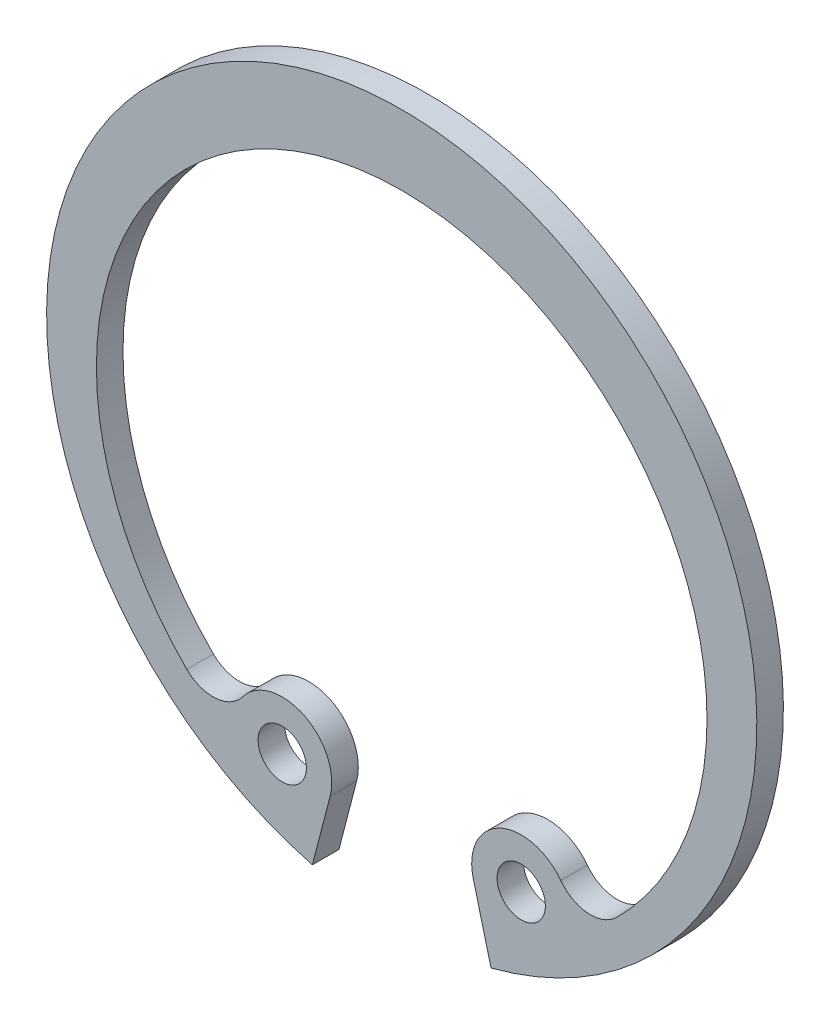
ISO-10303-21;
HEADER;
FILE_DESCRIPTION(('STEP AP214'),'2;1');
FILE_NAME('part.step','',(''),(''),'','','');
FILE_SCHEMA(('AUTOMOTIVE_DESIGN { 1 0 10303 214 1 1 1 1 }'));
ENDSEC;
DATA;
#1=APPLICATION_CONTEXT('core data for automotive mechanical design processes');
#2=APPLICATION_PROTOCOL_DEFINITION('international standard','automotive_design',2000,#1);
#3=PRODUCT_CONTEXT('',#1,'mechanical');
#4=PRODUCT('Part','Part','',(#3));
#5=PRODUCT_RELATED_PRODUCT_CATEGORY('part','',(#4));
#6=PRODUCT_DEFINITION_FORMATION('','',#4);
#7=PRODUCT_DEFINITION_CONTEXT('part definition',#1,'design');
#8=PRODUCT_DEFINITION('design','',#6,#7);
#9=PRODUCT_DEFINITION_SHAPE('','',#8);
#10=(LENGTH_UNIT() NAMED_UNIT(*) SI_UNIT(.MILLI.,.METRE.));
#11=(NAMED_UNIT(*) PLANE_ANGLE_UNIT() SI_UNIT($,.RADIAN.));
#12=(NAMED_UNIT(*) SI_UNIT($,.STERADIAN.) SOLID_ANGLE_UNIT());
#13=UNCERTAINTY_MEASURE_WITH_UNIT(LENGTH_MEASURE(1.E-05),#10,'distance_accuracy_value','');
#14=(GEOMETRIC_REPRESENTATION_CONTEXT(3) GLOBAL_UNCERTAINTY_ASSIGNED_CONTEXT((#13)) GLOBAL_UNIT_ASSIGNED_CONTEXT((#10,
#11,#12)) REPRESENTATION_CONTEXT('',''));
#15=CARTESIAN_POINT('',(0.,0.,0.));
#16=DIRECTION('',(0.,0.,1.));
#17=DIRECTION('',(1.,0.,0.));
#18=AXIS2_PLACEMENT_3D('',#15,#16,#17);
#19=CARTESIAN_POINT('',(0.,0.,-1.1));
#20=DIRECTION('',(0.,0.,1.));
#21=DIRECTION('',(1.,0.,0.));
#22=AXIS2_PLACEMENT_3D('',#19,#20,#21);
#23=CYLINDRICAL_SURFACE('',#22,14.7);
#24=CARTESIAN_POINT('',(0.,0.,0.));
#25=DIRECTION('',(0.,0.,1.));
#26=DIRECTION('',(1.,0.,0.));
#27=AXIS2_PLACEMENT_3D('',#24,#25,#26);
#28=CIRCLE('',#27,14.7);
#29=CARTESIAN_POINT('',(3.69832542704429,-14.2271708022248,0.));
#30=VERTEX_POINT('',#29);
#31=CARTESIAN_POINT('',(-3.69832542704429,-14.2271708022248,0.));
#32=VERTEX_POINT('',#31);
#33=EDGE_CURVE('E129',#30,#32,#28,.T.);
#34=ORIENTED_EDGE('',*,*,#33,.F.);
#35=DIRECTION('',(0.,0.,1.));
#36=VECTOR('',#35,1.);
#37=CARTESIAN_POINT('',(3.69832542704429,-14.2271708022248,-1.1));
#38=LINE('',#37,#36);
#39=CARTESIAN_POINT('',(3.69832542704429,-14.2271708022248,-1.1));
#40=VERTEX_POINT('',#39);
#41=EDGE_CURVE('E11',#40,#30,#38,.T.);
#42=ORIENTED_EDGE('',*,*,#41,.F.);
#43=CARTESIAN_POINT('',(0.,0.,-1.1));
#44=DIRECTION('',(0.,0.,1.));
#45=DIRECTION('',(1.,0.,0.));
#46=AXIS2_PLACEMENT_3D('',#43,#44,#45);
#47=CIRCLE('',#46,14.7);
#48=CARTESIAN_POINT('',(-3.69832542704429,-14.2271708022248,-1.1));
#49=VERTEX_POINT('',#48);
#50=EDGE_CURVE('E150',#40,#49,#47,.T.);
#51=ORIENTED_EDGE('',*,*,#50,.T.);
#52=DIRECTION('',(0.,0.,1.));
#53=VECTOR('',#52,1.);
#54=CARTESIAN_POINT('',(-3.69832542704429,-14.2271708022248,-1.1));
#55=LINE('',#54,#53);
#56=EDGE_CURVE('E35',#49,#32,#55,.T.);
#57=ORIENTED_EDGE('',*,*,#56,.T.);
#58=EDGE_LOOP('',(#34,#42,#51,#57));
#59=FACE_BOUND('',#58,.T.);
#60=ADVANCED_FACE('F32',(#59),#23,.T.);
#61=CARTESIAN_POINT('',(3.69832542704429,-14.2271708022248,-1.1));
#62=DIRECTION('',(-0.967834748450666,-0.25158676374451,0.));
#63=DIRECTION('',(0.25158676374451,-0.967834748450666,0.));
#64=AXIS2_PLACEMENT_3D('',#61,#62,#63);
#65=PLANE('',#64);
#66=DIRECTION('',(0.25158676374451,-0.967834748450666,0.));
#67=VECTOR('',#66,1.);
#68=CARTESIAN_POINT('',(3.69832542704429,-14.2271708022248,0.));
#69=LINE('',#68,#67);
#70=CARTESIAN_POINT('',(2.96189326229575,-11.3941734365757,0.));
#71=VERTEX_POINT('',#70);
#72=EDGE_CURVE('E148',#71,#30,#69,.T.);
#73=ORIENTED_EDGE('',*,*,#72,.F.);
#74=DIRECTION('',(0.,0.,1.));
#75=VECTOR('',#74,1.);
#76=CARTESIAN_POINT('',(2.96189326229575,-11.3941734365757,-1.1));
#77=LINE('',#76,#75);
#78=CARTESIAN_POINT('',(2.96189326229575,-11.3941734365757,-1.1));
#79=VERTEX_POINT('',#78);
#80=EDGE_CURVE('E41',#79,#71,#77,.T.);
#81=ORIENTED_EDGE('',*,*,#80,.F.);
#82=DIRECTION('',(0.25158676374451,-0.967834748450666,0.));
#83=VECTOR('',#82,1.);
#84=CARTESIAN_POINT('',(3.69832542704429,-14.2271708022248,-1.1));
#85=LINE('',#84,#83);
#86=EDGE_CURVE('E119',#79,#40,#85,.T.);
#87=ORIENTED_EDGE('',*,*,#86,.T.);
#88=ORIENTED_EDGE('',*,*,#41,.T.);
#89=EDGE_LOOP('',(#73,#81,#87,#88));
#90=FACE_BOUND('',#89,.T.);
#91=ADVANCED_FACE('F162',(#90),#65,.T.);
#92=CARTESIAN_POINT('',(4.94595449661962,-10.8784205708994,-1.1));
#93=DIRECTION('',(0.,0.,1.));
#94=DIRECTION('',(1.,0.,0.));
#95=AXIS2_PLACEMENT_3D('',#92,#93,#94);
#96=CYLINDRICAL_SURFACE('',#95,2.05);
#97=CARTESIAN_POINT('',(4.94595449661962,-10.8784205708994,0.));
#98=DIRECTION('',(0.,0.,1.));
#99=DIRECTION('',(1.,0.,0.));
#100=AXIS2_PLACEMENT_3D('',#97,#98,#99);
#101=CIRCLE('',#100,2.05);
#102=CARTESIAN_POINT('',(6.58465515486157,-9.6466900189209,0.));
#103=VERTEX_POINT('',#102);
#104=EDGE_CURVE('E106',#103,#71,#101,.T.);
#105=ORIENTED_EDGE('',*,*,#104,.F.);
#106=DIRECTION('',(0.,0.,1.));
#107=VECTOR('',#106,1.);
#108=CARTESIAN_POINT('',(6.58465515486157,-9.6466900189209,-1.1));
#109=LINE('',#108,#107);
#110=CARTESIAN_POINT('',(6.58465515486157,-9.6466900189209,-1.1));
#111=VERTEX_POINT('',#110);
#112=EDGE_CURVE('E101',#111,#103,#109,.T.);
#113=ORIENTED_EDGE('',*,*,#112,.F.);
#114=CARTESIAN_POINT('',(4.94595449661962,-10.8784205708994,-1.1));
#115=DIRECTION('',(0.,0.,1.));
#116=DIRECTION('',(1.,0.,0.));
#117=AXIS2_PLACEMENT_3D('',#114,#115,#116);
#118=CIRCLE('',#117,2.05);
#119=EDGE_CURVE('E104',#111,#79,#118,.T.);
#120=ORIENTED_EDGE('',*,*,#119,.T.);
#121=ORIENTED_EDGE('',*,*,#80,.T.);
#122=EDGE_LOOP('',(#105,#113,#120,#121));
#123=FACE_BOUND('',#122,.T.);
#124=ADVANCED_FACE('F103',(#123),#96,.T.);
#125=CARTESIAN_POINT('',(7.81368064854304,-8.72289210493699,-1.1));
#126=DIRECTION('',(0.,0.,1.));
#127=DIRECTION('',(1.,0.,0.));
#128=AXIS2_PLACEMENT_3D('',#125,#126,#127);
#129=CYLINDRICAL_SURFACE('',#128,1.5375);
#130=CARTESIAN_POINT('',(7.81368064854304,-8.72289210493699,0.));
#131=DIRECTION('',(0.,0.,-1.));
#132=DIRECTION('',(1.,0.,0.));
#133=AXIS2_PLACEMENT_3D('',#130,#131,#132);
#134=CIRCLE('',#133,1.5375);
#135=CARTESIAN_POINT('',(8.89592191479918,-9.81498188678294,0.));
#136=VERTEX_POINT('',#135);
#137=EDGE_CURVE('E145',#136,#103,#134,.T.);
#138=ORIENTED_EDGE('',*,*,#137,.F.);
#139=DIRECTION('',(0.,0.,1.));
#140=VECTOR('',#139,1.);
#141=CARTESIAN_POINT('',(8.89592191479918,-9.81498188678294,-1.1));
#142=LINE('',#141,#140);
#143=CARTESIAN_POINT('',(8.89592191479918,-9.81498188678294,-1.1));
#144=VERTEX_POINT('',#143);
#145=EDGE_CURVE('E111',#144,#136,#142,.T.);
#146=ORIENTED_EDGE('',*,*,#145,.F.);
#147=CARTESIAN_POINT('',(7.81368064854304,-8.72289210493699,-1.1));
#148=DIRECTION('',(0.,0.,-1.));
#149=DIRECTION('',(1.,0.,0.));
#150=AXIS2_PLACEMENT_3D('',#147,#148,#149);
#151=CIRCLE('',#150,1.5375);
#152=EDGE_CURVE('E117',#144,#111,#151,.T.);
#153=ORIENTED_EDGE('',*,*,#152,.T.);
#154=ORIENTED_EDGE('',*,*,#112,.T.);
#155=EDGE_LOOP('',(#138,#146,#153,#154));
#156=FACE_BOUND('',#155,.T.);
#157=ADVANCED_FACE('F121',(#156),#129,.F.);
#158=CARTESIAN_POINT('',(0.,-0.838106095620556,-1.1));
#159=DIRECTION('',(0.,0.,1.));
#160=DIRECTION('',(1.,0.,0.));
#161=AXIS2_PLACEMENT_3D('',#158,#159,#160);
#162=CYLINDRICAL_SURFACE('',#161,12.6381060956206);
#163=CARTESIAN_POINT('',(0.,-0.838106095620556,0.));
#164=DIRECTION('',(0.,0.,-1.));
#165=DIRECTION('',(1.,0.,0.));
#166=AXIS2_PLACEMENT_3D('',#163,#164,#165);
#167=CIRCLE('',#166,12.6381060956206);
#168=CARTESIAN_POINT('',(-8.89592191479917,-9.81498188678293,0.));
#169=VERTEX_POINT('',#168);
#170=EDGE_CURVE('E142',#169,#136,#167,.T.);
#171=ORIENTED_EDGE('',*,*,#170,.F.);
#172=DIRECTION('',(0.,0.,1.));
#173=VECTOR('',#172,1.);
#174=CARTESIAN_POINT('',(-8.89592191479917,-9.81498188678293,-1.1));
#175=LINE('',#174,#173);
#176=CARTESIAN_POINT('',(-8.89592191479917,-9.81498188678293,-1.1));
#177=VERTEX_POINT('',#176);
#178=EDGE_CURVE('E154',#177,#169,#175,.T.);
#179=ORIENTED_EDGE('',*,*,#178,.F.);
#180=CARTESIAN_POINT('',(0.,-0.838106095620556,-1.1));
#181=DIRECTION('',(0.,0.,-1.));
#182=DIRECTION('',(1.,0.,0.));
#183=AXIS2_PLACEMENT_3D('',#180,#181,#182);
#184=CIRCLE('',#183,12.6381060956206);
#185=EDGE_CURVE('E122',#177,#144,#184,.T.);
#186=ORIENTED_EDGE('',*,*,#185,.T.);
#187=ORIENTED_EDGE('',*,*,#145,.T.);
#188=EDGE_LOOP('',(#171,#179,#186,#187));
#189=FACE_BOUND('',#188,.T.);
#190=ADVANCED_FACE('F175',(#189),#162,.F.);
#191=CARTESIAN_POINT('',(-7.81368064854304,-8.72289210493699,-1.1));
#192=DIRECTION('',(0.,0.,1.));
#193=DIRECTION('',(1.,0.,0.));
#194=AXIS2_PLACEMENT_3D('',#191,#192,#193);
#195=CYLINDRICAL_SURFACE('',#194,1.5375);
#196=CARTESIAN_POINT('',(-7.81368064854304,-8.72289210493699,0.));
#197=DIRECTION('',(0.,0.,-1.));
#198=DIRECTION('',(1.,0.,0.));
#199=AXIS2_PLACEMENT_3D('',#196,#197,#198);
#200=CIRCLE('',#199,1.5375);
#201=CARTESIAN_POINT('',(-6.58465515486157,-9.6466900189209,0.));
#202=VERTEX_POINT('',#201);
#203=EDGE_CURVE('E139',#202,#169,#200,.T.);
#204=ORIENTED_EDGE('',*,*,#203,.F.);
#205=DIRECTION('',(0.,0.,1.));
#206=VECTOR('',#205,1.);
#207=CARTESIAN_POINT('',(-6.58465515486157,-9.6466900189209,-1.1));
#208=LINE('',#207,#206);
#209=CARTESIAN_POINT('',(-6.58465515486157,-9.6466900189209,-1.1));
#210=VERTEX_POINT('',#209);
#211=EDGE_CURVE('E156',#210,#202,#208,.T.);
#212=ORIENTED_EDGE('',*,*,#211,.F.);
#213=CARTESIAN_POINT('',(-7.81368064854304,-8.72289210493699,-1.1));
#214=DIRECTION('',(0.,0.,-1.));
#215=DIRECTION('',(1.,0.,0.));
#216=AXIS2_PLACEMENT_3D('',#213,#214,#215);
#217=CIRCLE('',#216,1.5375);
#218=EDGE_CURVE('E124',#210,#177,#217,.T.);
#219=ORIENTED_EDGE('',*,*,#218,.T.);
#220=ORIENTED_EDGE('',*,*,#178,.T.);
#221=EDGE_LOOP('',(#204,#212,#219,#220));
#222=FACE_BOUND('',#221,.T.);
#223=ADVANCED_FACE('F178',(#222),#195,.F.);
#224=CARTESIAN_POINT('',(-4.94595449661962,-10.8784205708994,-1.1));
#225=DIRECTION('',(0.,0.,1.));
#226=DIRECTION('',(1.,0.,0.));
#227=AXIS2_PLACEMENT_3D('',#224,#225,#226);
#228=CYLINDRICAL_SURFACE('',#227,2.05);
#229=CARTESIAN_POINT('',(-4.94595449661962,-10.8784205708994,0.));
#230=DIRECTION('',(0.,0.,1.));
#231=DIRECTION('',(1.,0.,0.));
#232=AXIS2_PLACEMENT_3D('',#229,#230,#231);
#233=CIRCLE('',#232,2.05);
#234=CARTESIAN_POINT('',(-2.96189326229575,-11.3941734365757,0.));
#235=VERTEX_POINT('',#234);
#236=EDGE_CURVE('E136',#235,#202,#233,.T.);
#237=ORIENTED_EDGE('',*,*,#236,.F.);
#238=DIRECTION('',(0.,0.,1.));
#239=VECTOR('',#238,1.);
#240=CARTESIAN_POINT('',(-2.96189326229575,-11.3941734365757,-1.1));
#241=LINE('',#240,#239);
#242=CARTESIAN_POINT('',(-2.96189326229575,-11.3941734365757,-1.1));
#243=VERTEX_POINT('',#242);
#244=EDGE_CURVE('E157',#243,#235,#241,.T.);
#245=ORIENTED_EDGE('',*,*,#244,.F.);
#246=CARTESIAN_POINT('',(-4.94595449661962,-10.8784205708994,-1.1));
#247=DIRECTION('',(0.,0.,1.));
#248=DIRECTION('',(1.,0.,0.));
#249=AXIS2_PLACEMENT_3D('',#246,#247,#248);
#250=CIRCLE('',#249,2.05);
#251=EDGE_CURVE('E224',#243,#210,#250,.T.);
#252=ORIENTED_EDGE('',*,*,#251,.T.);
#253=ORIENTED_EDGE('',*,*,#211,.T.);
#254=EDGE_LOOP('',(#237,#245,#252,#253));
#255=FACE_BOUND('',#254,.T.);
#256=ADVANCED_FACE('F182',(#255),#228,.T.);
#257=CARTESIAN_POINT('',(-3.69832542704429,-14.2271708022248,-1.1));
#258=DIRECTION('',(0.967834748450666,-0.251586763744509,0.));
#259=DIRECTION('',(0.251586763744509,0.967834748450666,0.));
#260=AXIS2_PLACEMENT_3D('',#257,#258,#259);
#261=PLANE('',#260);
#262=DIRECTION('',(0.251586763744509,0.967834748450666,0.));
#263=VECTOR('',#262,1.);
#264=CARTESIAN_POINT('',(-3.69832542704429,-14.2271708022248,0.));
#265=LINE('',#264,#263);
#266=EDGE_CURVE('E132',#32,#235,#265,.T.);
#267=ORIENTED_EDGE('',*,*,#266,.F.);
#268=ORIENTED_EDGE('',*,*,#56,.F.);
#269=DIRECTION('',(0.251586763744509,0.967834748450666,0.));
#270=VECTOR('',#269,1.);
#271=CARTESIAN_POINT('',(-3.69832542704429,-14.2271708022248,-1.1));
#272=LINE('',#271,#270);
#273=EDGE_CURVE('E222',#49,#243,#272,.T.);
#274=ORIENTED_EDGE('',*,*,#273,.T.);
#275=ORIENTED_EDGE('',*,*,#244,.T.);
#276=EDGE_LOOP('',(#267,#268,#274,#275));
#277=FACE_BOUND('',#276,.T.);
#278=ADVANCED_FACE('F159',(#277),#261,.T.);
#279=CARTESIAN_POINT('',(0.,0.,-1.1));
#280=DIRECTION('',(0.,0.,1.));
#281=DIRECTION('',(1.,0.,0.));
#282=AXIS2_PLACEMENT_3D('',#279,#280,#281);
#283=PLANE('',#282);
#284=CARTESIAN_POINT('',(-4.94595449661962,-10.8784205708994,-1.1));
#285=DIRECTION('',(0.,0.,1.));
#286=DIRECTION('',(1.,0.,0.));
#287=AXIS2_PLACEMENT_3D('',#284,#285,#286);
#288=CIRCLE('',#287,1.);
#289=CARTESIAN_POINT('',(-3.94595449661962,-10.8784205708994,-1.1));
#290=VERTEX_POINT('',#289);
#291=EDGE_CURVE('E209',#290,#290,#288,.T.);
#292=ORIENTED_EDGE('',*,*,#291,.T.);
#293=EDGE_LOOP('',(#292));
#294=FACE_BOUND('',#293,.T.);
#295=CARTESIAN_POINT('',(4.94595449661962,-10.8784205708994,-1.1));
#296=DIRECTION('',(0.,0.,1.));
#297=DIRECTION('',(1.,0.,0.));
#298=AXIS2_PLACEMENT_3D('',#295,#296,#297);
#299=CIRCLE('',#298,1.);
#300=CARTESIAN_POINT('',(5.94595449661962,-10.8784205708994,-1.1));
#301=VERTEX_POINT('',#300);
#302=EDGE_CURVE('E133',#301,#301,#299,.T.);
#303=ORIENTED_EDGE('',*,*,#302,.T.);
#304=EDGE_LOOP('',(#303));
#305=FACE_BOUND('',#304,.T.);
#306=ORIENTED_EDGE('',*,*,#50,.F.);
#307=ORIENTED_EDGE('',*,*,#86,.F.);
#308=ORIENTED_EDGE('',*,*,#119,.F.);
#309=ORIENTED_EDGE('',*,*,#152,.F.);
#310=ORIENTED_EDGE('',*,*,#185,.F.);
#311=ORIENTED_EDGE('',*,*,#218,.F.);
#312=ORIENTED_EDGE('',*,*,#251,.F.);
#313=ORIENTED_EDGE('',*,*,#273,.F.);
#314=EDGE_LOOP('',(#306,#307,#308,#309,#310,#311,#312,#313));
#315=FACE_BOUND('',#314,.T.);
#316=ADVANCED_FACE('F115',(#294,#305,#315),#283,.F.);
#317=CARTESIAN_POINT('',(0.,0.,0.));
#318=DIRECTION('',(0.,0.,1.));
#319=DIRECTION('',(1.,0.,0.));
#320=AXIS2_PLACEMENT_3D('',#317,#318,#319);
#321=PLANE('',#320);
#322=CARTESIAN_POINT('',(-4.94595449661962,-10.8784205708994,0.));
#323=DIRECTION('',(0.,0.,1.));
#324=DIRECTION('',(1.,0.,0.));
#325=AXIS2_PLACEMENT_3D('',#322,#323,#324);
#326=CIRCLE('',#325,1.);
#327=CARTESIAN_POINT('',(-3.94595449661962,-10.8784205708994,0.));
#328=VERTEX_POINT('',#327);
#329=EDGE_CURVE('E212',#328,#328,#326,.T.);
#330=ORIENTED_EDGE('',*,*,#329,.F.);
#331=EDGE_LOOP('',(#330));
#332=FACE_BOUND('',#331,.T.);
#333=CARTESIAN_POINT('',(4.94595449661962,-10.8784205708994,0.));
#334=DIRECTION('',(0.,0.,1.));
#335=DIRECTION('',(1.,0.,0.));
#336=AXIS2_PLACEMENT_3D('',#333,#334,#335);
#337=CIRCLE('',#336,1.);
#338=CARTESIAN_POINT('',(5.94595449661962,-10.8784205708994,0.));
#339=VERTEX_POINT('',#338);
#340=EDGE_CURVE('E214',#339,#339,#337,.T.);
#341=ORIENTED_EDGE('',*,*,#340,.F.);
#342=EDGE_LOOP('',(#341));
#343=FACE_BOUND('',#342,.T.);
#344=ORIENTED_EDGE('',*,*,#33,.T.);
#345=ORIENTED_EDGE('',*,*,#266,.T.);
#346=ORIENTED_EDGE('',*,*,#236,.T.);
#347=ORIENTED_EDGE('',*,*,#203,.T.);
#348=ORIENTED_EDGE('',*,*,#170,.T.);
#349=ORIENTED_EDGE('',*,*,#137,.T.);
#350=ORIENTED_EDGE('',*,*,#104,.T.);
#351=ORIENTED_EDGE('',*,*,#72,.T.);
#352=EDGE_LOOP('',(#344,#345,#346,#347,#348,#349,#350,#351));
#353=FACE_BOUND('',#352,.T.);
#354=ADVANCED_FACE('F161',(#332,#343,#353),#321,.T.);
#355=CARTESIAN_POINT('',(4.94595449661962,-10.8784205708994,-1.1));
#356=DIRECTION('',(0.,0.,1.));
#357=DIRECTION('',(1.,0.,0.));
#358=AXIS2_PLACEMENT_3D('',#355,#356,#357);
#359=CYLINDRICAL_SURFACE('',#358,1.);
#360=ORIENTED_EDGE('',*,*,#302,.F.);
#361=EDGE_LOOP('',(#360));
#362=FACE_BOUND('',#361,.T.);
#363=ORIENTED_EDGE('',*,*,#340,.T.);
#364=EDGE_LOOP('',(#363));
#365=FACE_BOUND('',#364,.T.);
#366=ADVANCED_FACE('F194',(#362,#365),#359,.F.);
#367=CARTESIAN_POINT('',(-4.94595449661962,-10.8784205708994,-1.1));
#368=DIRECTION('',(0.,0.,1.));
#369=DIRECTION('',(1.,0.,0.));
#370=AXIS2_PLACEMENT_3D('',#367,#368,#369);
#371=CYLINDRICAL_SURFACE('',#370,1.);
#372=ORIENTED_EDGE('',*,*,#291,.F.);
#373=EDGE_LOOP('',(#372));
#374=FACE_BOUND('',#373,.T.);
#375=ORIENTED_EDGE('',*,*,#329,.T.);
#376=EDGE_LOOP('',(#375));
#377=FACE_BOUND('',#376,.T.);
#378=ADVANCED_FACE('F201',(#374,#377),#371,.F.);
#379=CLOSED_SHELL('',(#60,#91,#124,#157,#190,#223,#256,#278,#316,#354,#366,#378));
#380=MANIFOLD_SOLID_BREP('B2',#379);
#381=ADVANCED_BREP_SHAPE_REPRESENTATION('',(#18,#380),#14);
#382=SHAPE_DEFINITION_REPRESENTATION(#9,#381);
ENDSEC;
END-ISO-10303-21;
